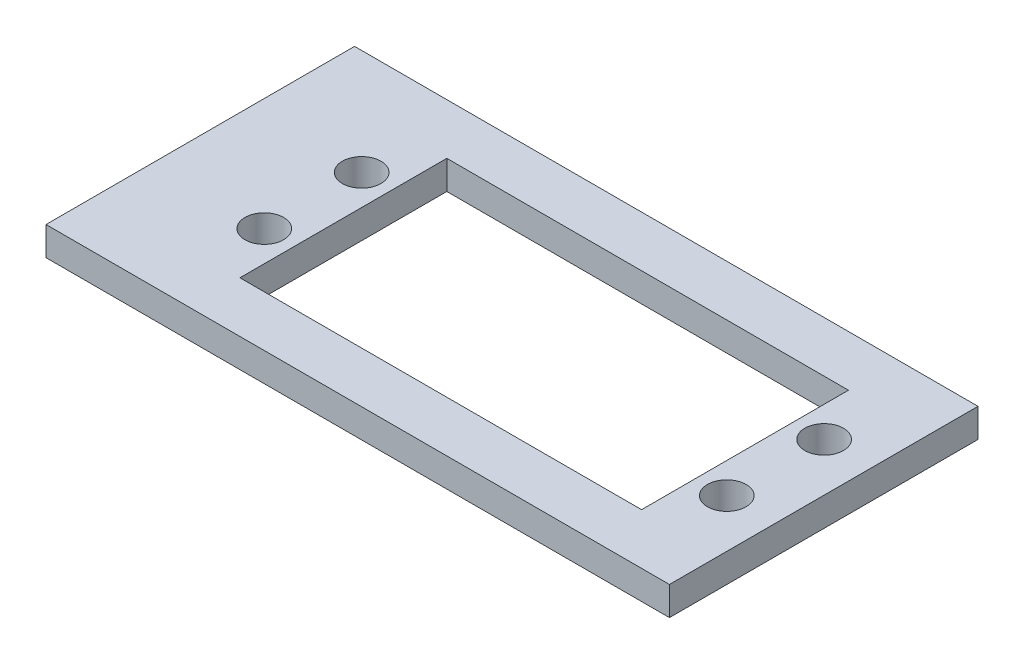
ISO-10303-21;
HEADER;
FILE_DESCRIPTION(('STEP AP214'),'2;1');
FILE_NAME('part.step','',(''),(''),'','','');
FILE_SCHEMA(('AUTOMOTIVE_DESIGN { 1 0 10303 214 1 1 1 1 }'));
ENDSEC;
DATA;
#1=APPLICATION_CONTEXT('core data for automotive mechanical design processes');
#2=APPLICATION_PROTOCOL_DEFINITION('international standard','automotive_design',2000,#1);
#3=PRODUCT_CONTEXT('',#1,'mechanical');
#4=PRODUCT('Part','Part','',(#3));
#5=PRODUCT_RELATED_PRODUCT_CATEGORY('part','',(#4));
#6=PRODUCT_DEFINITION_FORMATION('','',#4);
#7=PRODUCT_DEFINITION_CONTEXT('part definition',#1,'design');
#8=PRODUCT_DEFINITION('design','',#6,#7);
#9=PRODUCT_DEFINITION_SHAPE('','',#8);
#10=(LENGTH_UNIT() NAMED_UNIT(*) SI_UNIT(.MILLI.,.METRE.));
#11=(NAMED_UNIT(*) PLANE_ANGLE_UNIT() SI_UNIT($,.RADIAN.));
#12=(NAMED_UNIT(*) SI_UNIT($,.STERADIAN.) SOLID_ANGLE_UNIT());
#13=UNCERTAINTY_MEASURE_WITH_UNIT(LENGTH_MEASURE(1.E-05),#10,'distance_accuracy_value','');
#14=(GEOMETRIC_REPRESENTATION_CONTEXT(3) GLOBAL_UNCERTAINTY_ASSIGNED_CONTEXT((#13)) GLOBAL_UNIT_ASSIGNED_CONTEXT((#10,
#11,#12)) REPRESENTATION_CONTEXT('',''));
#15=CARTESIAN_POINT('',(0.,0.,0.));
#16=DIRECTION('',(0.,0.,1.));
#17=DIRECTION('',(1.,0.,0.));
#18=AXIS2_PLACEMENT_3D('',#15,#16,#17);
#19=CARTESIAN_POINT('',(0.,3.,-20.8673508669521));
#20=DIRECTION('',(0.,0.,-1.));
#21=DIRECTION('',(-1.,0.,0.));
#22=AXIS2_PLACEMENT_3D('',#19,#20,#21);
#23=PLANE('',#22);
#24=DIRECTION('',(1.,0.,0.));
#25=VECTOR('',#24,1.);
#26=CARTESIAN_POINT('',(0.,0.,-20.8673508669521));
#27=LINE('',#26,#25);
#28=CARTESIAN_POINT('',(-41.7204147572577,0.,-20.8673508669521));
#29=VERTEX_POINT('',#28);
#30=CARTESIAN_POINT('',(0.18958524274228,0.,-20.8673508669521));
#31=VERTEX_POINT('',#30);
#32=EDGE_CURVE('E172',#29,#31,#27,.T.);
#33=ORIENTED_EDGE('',*,*,#32,.T.);
#34=DIRECTION('',(0.,-1.,0.));
#35=VECTOR('',#34,1.);
#36=CARTESIAN_POINT('',(0.18958524274228,3.,-20.8673508669521));
#37=LINE('',#36,#35);
#38=CARTESIAN_POINT('',(0.18958524274228,3.,-20.8673508669521));
#39=VERTEX_POINT('',#38);
#40=EDGE_CURVE('E11',#39,#31,#37,.T.);
#41=ORIENTED_EDGE('',*,*,#40,.F.);
#42=DIRECTION('',(1.,0.,0.));
#43=VECTOR('',#42,1.);
#44=CARTESIAN_POINT('',(0.,3.,-20.8673508669521));
#45=LINE('',#44,#43);
#46=CARTESIAN_POINT('',(-41.7204147572577,3.,-20.8673508669521));
#47=VERTEX_POINT('',#46);
#48=EDGE_CURVE('E128',#47,#39,#45,.T.);
#49=ORIENTED_EDGE('',*,*,#48,.F.);
#50=DIRECTION('',(0.,-1.,0.));
#51=VECTOR('',#50,1.);
#52=CARTESIAN_POINT('',(-41.7204147572577,3.,-20.8673508669521));
#53=LINE('',#52,#51);
#54=EDGE_CURVE('E183',#47,#29,#53,.T.);
#55=ORIENTED_EDGE('',*,*,#54,.T.);
#56=EDGE_LOOP('',(#33,#41,#49,#55));
#57=FACE_BOUND('',#56,.T.);
#58=ADVANCED_FACE('F39',(#57),#23,.F.);
#59=CARTESIAN_POINT('',(0.18958524274228,3.,0.));
#60=DIRECTION('',(-1.,0.,0.));
#61=DIRECTION('',(0.,0.,1.));
#62=AXIS2_PLACEMENT_3D('',#59,#60,#61);
#63=PLANE('',#62);
#64=DIRECTION('',(0.,0.,-1.));
#65=VECTOR('',#64,1.);
#66=CARTESIAN_POINT('',(0.18958524274228,0.,0.));
#67=LINE('',#66,#65);
#68=CARTESIAN_POINT('',(0.18958524274228,0.,0.722649133047922));
#69=VERTEX_POINT('',#68);
#70=EDGE_CURVE('E118',#69,#31,#67,.T.);
#71=ORIENTED_EDGE('',*,*,#70,.F.);
#72=DIRECTION('',(0.,-1.,0.));
#73=VECTOR('',#72,1.);
#74=CARTESIAN_POINT('',(0.18958524274228,3.,0.722649133047922));
#75=LINE('',#74,#73);
#76=CARTESIAN_POINT('',(0.18958524274228,3.,0.722649133047922));
#77=VERTEX_POINT('',#76);
#78=EDGE_CURVE('E50',#77,#69,#75,.T.);
#79=ORIENTED_EDGE('',*,*,#78,.F.);
#80=DIRECTION('',(0.,0.,-1.));
#81=VECTOR('',#80,1.);
#82=CARTESIAN_POINT('',(0.18958524274228,3.,0.));
#83=LINE('',#82,#81);
#84=EDGE_CURVE('E116',#77,#39,#83,.T.);
#85=ORIENTED_EDGE('',*,*,#84,.T.);
#86=ORIENTED_EDGE('',*,*,#40,.T.);
#87=EDGE_LOOP('',(#71,#79,#85,#86));
#88=FACE_BOUND('',#87,.T.);
#89=ADVANCED_FACE('F115',(#88),#63,.T.);
#90=CARTESIAN_POINT('',(0.,3.,0.722649133047922));
#91=DIRECTION('',(0.,0.,-1.));
#92=DIRECTION('',(-1.,0.,0.));
#93=AXIS2_PLACEMENT_3D('',#90,#91,#92);
#94=PLANE('',#93);
#95=DIRECTION('',(1.,0.,0.));
#96=VECTOR('',#95,1.);
#97=CARTESIAN_POINT('',(0.,0.,0.722649133047922));
#98=LINE('',#97,#96);
#99=CARTESIAN_POINT('',(-41.7204147572577,0.,0.722649133047922));
#100=VERTEX_POINT('',#99);
#101=EDGE_CURVE('E178',#100,#69,#98,.T.);
#102=ORIENTED_EDGE('',*,*,#101,.F.);
#103=DIRECTION('',(0.,-1.,0.));
#104=VECTOR('',#103,1.);
#105=CARTESIAN_POINT('',(-41.7204147572577,3.,0.722649133047922));
#106=LINE('',#105,#104);
#107=CARTESIAN_POINT('',(-41.7204147572577,3.,0.722649133047922));
#108=VERTEX_POINT('',#107);
#109=EDGE_CURVE('E86',#108,#100,#106,.T.);
#110=ORIENTED_EDGE('',*,*,#109,.F.);
#111=DIRECTION('',(1.,0.,0.));
#112=VECTOR('',#111,1.);
#113=CARTESIAN_POINT('',(0.,3.,0.722649133047922));
#114=LINE('',#113,#112);
#115=EDGE_CURVE('E126',#108,#77,#114,.T.);
#116=ORIENTED_EDGE('',*,*,#115,.T.);
#117=ORIENTED_EDGE('',*,*,#78,.T.);
#118=EDGE_LOOP('',(#102,#110,#116,#117));
#119=FACE_BOUND('',#118,.T.);
#120=ADVANCED_FACE('F132',(#119),#94,.T.);
#121=CARTESIAN_POINT('',(0.,3.,-26.1714026151938));
#122=DIRECTION('',(0.,0.,1.));
#123=DIRECTION('',(1.,0.,0.));
#124=AXIS2_PLACEMENT_3D('',#121,#122,#123);
#125=PLANE('',#124);
#126=DIRECTION('',(-1.,0.,0.));
#127=VECTOR('',#126,1.);
#128=CARTESIAN_POINT('',(0.,0.,-26.1714026151938));
#129=LINE('',#128,#127);
#130=CARTESIAN_POINT('',(8.4020641389915,0.,-26.1714026151938));
#131=VERTEX_POINT('',#130);
#132=CARTESIAN_POINT('',(-56.6534698572577,0.,-26.1714026151938));
#133=VERTEX_POINT('',#132);
#134=EDGE_CURVE('E140',#131,#133,#129,.T.);
#135=ORIENTED_EDGE('',*,*,#134,.T.);
#136=DIRECTION('',(0.,-1.,0.));
#137=VECTOR('',#136,1.);
#138=CARTESIAN_POINT('',(-56.6534698572577,3.,-26.1714026151938));
#139=LINE('',#138,#137);
#140=CARTESIAN_POINT('',(-56.6534698572577,3.,-26.1714026151938));
#141=VERTEX_POINT('',#140);
#142=EDGE_CURVE('E43',#141,#133,#139,.T.);
#143=ORIENTED_EDGE('',*,*,#142,.F.);
#144=DIRECTION('',(-1.,0.,0.));
#145=VECTOR('',#144,1.);
#146=CARTESIAN_POINT('',(0.,3.,-26.1714026151938));
#147=LINE('',#146,#145);
#148=CARTESIAN_POINT('',(8.4020641389915,3.,-26.1714026151938));
#149=VERTEX_POINT('',#148);
#150=EDGE_CURVE('E98',#149,#141,#147,.T.);
#151=ORIENTED_EDGE('',*,*,#150,.F.);
#152=DIRECTION('',(0.,-1.,0.));
#153=VECTOR('',#152,1.);
#154=CARTESIAN_POINT('',(8.4020641389915,3.,-26.1714026151938));
#155=LINE('',#154,#153);
#156=EDGE_CURVE('E136',#149,#131,#155,.T.);
#157=ORIENTED_EDGE('',*,*,#156,.T.);
#158=EDGE_LOOP('',(#135,#143,#151,#157));
#159=FACE_BOUND('',#158,.T.);
#160=ADVANCED_FACE('F41',(#159),#125,.F.);
#161=CARTESIAN_POINT('',(-56.6534698572577,3.,0.));
#162=DIRECTION('',(-1.,0.,0.));
#163=DIRECTION('',(0.,0.,1.));
#164=AXIS2_PLACEMENT_3D('',#161,#162,#163);
#165=PLANE('',#164);
#166=DIRECTION('',(0.,0.,-1.));
#167=VECTOR('',#166,1.);
#168=CARTESIAN_POINT('',(-56.6534698572577,0.,0.));
#169=LINE('',#168,#167);
#170=CARTESIAN_POINT('',(-56.6534698572577,0.,6.0267008812897));
#171=VERTEX_POINT('',#170);
#172=EDGE_CURVE('E144',#171,#133,#169,.T.);
#173=ORIENTED_EDGE('',*,*,#172,.F.);
#174=DIRECTION('',(0.,-1.,0.));
#175=VECTOR('',#174,1.);
#176=CARTESIAN_POINT('',(-56.6534698572577,3.,6.0267008812897));
#177=LINE('',#176,#175);
#178=CARTESIAN_POINT('',(-56.6534698572577,3.,6.0267008812897));
#179=VERTEX_POINT('',#178);
#180=EDGE_CURVE('E192',#179,#171,#177,.T.);
#181=ORIENTED_EDGE('',*,*,#180,.F.);
#182=DIRECTION('',(0.,0.,-1.));
#183=VECTOR('',#182,1.);
#184=CARTESIAN_POINT('',(-56.6534698572577,3.,0.));
#185=LINE('',#184,#183);
#186=EDGE_CURVE('E202',#179,#141,#185,.T.);
#187=ORIENTED_EDGE('',*,*,#186,.T.);
#188=ORIENTED_EDGE('',*,*,#142,.T.);
#189=EDGE_LOOP('',(#173,#181,#187,#188));
#190=FACE_BOUND('',#189,.T.);
#191=ADVANCED_FACE('F201',(#190),#165,.T.);
#192=CARTESIAN_POINT('',(0.,3.,6.0267008812897));
#193=DIRECTION('',(0.,0.,1.));
#194=DIRECTION('',(1.,0.,0.));
#195=AXIS2_PLACEMENT_3D('',#192,#193,#194);
#196=PLANE('',#195);
#197=DIRECTION('',(-1.,0.,0.));
#198=VECTOR('',#197,1.);
#199=CARTESIAN_POINT('',(0.,0.,6.0267008812897));
#200=LINE('',#199,#198);
#201=CARTESIAN_POINT('',(8.4020641389915,0.,6.0267008812897));
#202=VERTEX_POINT('',#201);
#203=EDGE_CURVE('E148',#202,#171,#200,.T.);
#204=ORIENTED_EDGE('',*,*,#203,.F.);
#205=DIRECTION('',(0.,-1.,0.));
#206=VECTOR('',#205,1.);
#207=CARTESIAN_POINT('',(8.4020641389915,3.,6.0267008812897));
#208=LINE('',#207,#206);
#209=CARTESIAN_POINT('',(8.4020641389915,3.,6.0267008812897));
#210=VERTEX_POINT('',#209);
#211=EDGE_CURVE('E190',#210,#202,#208,.T.);
#212=ORIENTED_EDGE('',*,*,#211,.F.);
#213=DIRECTION('',(-1.,0.,0.));
#214=VECTOR('',#213,1.);
#215=CARTESIAN_POINT('',(0.,3.,6.0267008812897));
#216=LINE('',#215,#214);
#217=EDGE_CURVE('E211',#210,#179,#216,.T.);
#218=ORIENTED_EDGE('',*,*,#217,.T.);
#219=ORIENTED_EDGE('',*,*,#180,.T.);
#220=EDGE_LOOP('',(#204,#212,#218,#219));
#221=FACE_BOUND('',#220,.T.);
#222=ADVANCED_FACE('F209',(#221),#196,.T.);
#223=CARTESIAN_POINT('',(3.36458524274226,3.,-15.1523508669521));
#224=DIRECTION('',(0.,-1.,0.));
#225=DIRECTION('',(0.,0.,-1.));
#226=AXIS2_PLACEMENT_3D('',#223,#224,#225);
#227=CYLINDRICAL_SURFACE('',#226,2.01930000000001);
#228=CARTESIAN_POINT('',(3.36458524274226,3.,-15.1523508669521));
#229=DIRECTION('',(0.,1.,0.));
#230=DIRECTION('',(0.,0.,1.));
#231=AXIS2_PLACEMENT_3D('',#228,#229,#230);
#232=CIRCLE('',#231,2.01930000000001);
#233=CARTESIAN_POINT('',(3.36458524274226,3.,-13.1330508669521));
#234=VERTEX_POINT('',#233);
#235=EDGE_CURVE('E235',#234,#234,#232,.T.);
#236=ORIENTED_EDGE('',*,*,#235,.T.);
#237=EDGE_LOOP('',(#236));
#238=FACE_BOUND('',#237,.T.);
#239=CARTESIAN_POINT('',(3.36458524274226,0.,-15.1523508669521));
#240=DIRECTION('',(0.,1.,0.));
#241=DIRECTION('',(0.,0.,1.));
#242=AXIS2_PLACEMENT_3D('',#239,#240,#241);
#243=CIRCLE('',#242,2.01930000000001);
#244=CARTESIAN_POINT('',(3.36458524274226,0.,-13.1330508669521));
#245=VERTEX_POINT('',#244);
#246=EDGE_CURVE('E168',#245,#245,#243,.T.);
#247=ORIENTED_EDGE('',*,*,#246,.F.);
#248=EDGE_LOOP('',(#247));
#249=FACE_BOUND('',#248,.T.);
#250=ADVANCED_FACE('F241',(#238,#249),#227,.F.);
#251=CARTESIAN_POINT('',(3.36458524274226,3.,-4.99235086695208));
#252=DIRECTION('',(0.,-1.,0.));
#253=DIRECTION('',(0.,0.,-1.));
#254=AXIS2_PLACEMENT_3D('',#251,#252,#253);
#255=CYLINDRICAL_SURFACE('',#254,2.01930000000001);
#256=CARTESIAN_POINT('',(3.36458524274226,3.,-4.99235086695208));
#257=DIRECTION('',(0.,1.,0.));
#258=DIRECTION('',(0.,0.,1.));
#259=AXIS2_PLACEMENT_3D('',#256,#257,#258);
#260=CIRCLE('',#259,2.01930000000001);
#261=CARTESIAN_POINT('',(3.36458524274226,3.,-2.97305086695207));
#262=VERTEX_POINT('',#261);
#263=EDGE_CURVE('E231',#262,#262,#260,.T.);
#264=ORIENTED_EDGE('',*,*,#263,.T.);
#265=EDGE_LOOP('',(#264));
#266=FACE_BOUND('',#265,.T.);
#267=CARTESIAN_POINT('',(3.36458524274226,0.,-4.99235086695208));
#268=DIRECTION('',(0.,1.,0.));
#269=DIRECTION('',(0.,0.,1.));
#270=AXIS2_PLACEMENT_3D('',#267,#268,#269);
#271=CIRCLE('',#270,2.01930000000001);
#272=CARTESIAN_POINT('',(3.36458524274226,0.,-2.97305086695207));
#273=VERTEX_POINT('',#272);
#274=EDGE_CURVE('E164',#273,#273,#271,.T.);
#275=ORIENTED_EDGE('',*,*,#274,.F.);
#276=EDGE_LOOP('',(#275));
#277=FACE_BOUND('',#276,.T.);
#278=ADVANCED_FACE('F264',(#266,#277),#255,.F.);
#279=CARTESIAN_POINT('',(-44.8954147572577,3.,-15.1523508669521));
#280=DIRECTION('',(0.,-1.,0.));
#281=DIRECTION('',(0.,0.,-1.));
#282=AXIS2_PLACEMENT_3D('',#279,#280,#281);
#283=CYLINDRICAL_SURFACE('',#282,2.01930000000001);
#284=CARTESIAN_POINT('',(-44.8954147572577,3.,-15.1523508669521));
#285=DIRECTION('',(0.,1.,0.));
#286=DIRECTION('',(0.,0.,1.));
#287=AXIS2_PLACEMENT_3D('',#284,#285,#286);
#288=CIRCLE('',#287,2.01930000000001);
#289=CARTESIAN_POINT('',(-44.8954147572577,3.,-13.1330508669521));
#290=VERTEX_POINT('',#289);
#291=EDGE_CURVE('E224',#290,#290,#288,.T.);
#292=ORIENTED_EDGE('',*,*,#291,.T.);
#293=EDGE_LOOP('',(#292));
#294=FACE_BOUND('',#293,.T.);
#295=CARTESIAN_POINT('',(-44.8954147572577,0.,-15.1523508669521));
#296=DIRECTION('',(0.,1.,0.));
#297=DIRECTION('',(0.,0.,1.));
#298=AXIS2_PLACEMENT_3D('',#295,#296,#297);
#299=CIRCLE('',#298,2.01930000000001);
#300=CARTESIAN_POINT('',(-44.8954147572577,0.,-13.1330508669521));
#301=VERTEX_POINT('',#300);
#302=EDGE_CURVE('E160',#301,#301,#299,.T.);
#303=ORIENTED_EDGE('',*,*,#302,.F.);
#304=EDGE_LOOP('',(#303));
#305=FACE_BOUND('',#304,.T.);
#306=ADVANCED_FACE('F267',(#294,#305),#283,.F.);
#307=CARTESIAN_POINT('',(-44.8954147572577,3.,-4.99235086695208));
#308=DIRECTION('',(0.,-1.,0.));
#309=DIRECTION('',(0.,0.,-1.));
#310=AXIS2_PLACEMENT_3D('',#307,#308,#309);
#311=CYLINDRICAL_SURFACE('',#310,2.01930000000001);
#312=CARTESIAN_POINT('',(-44.8954147572577,3.,-4.99235086695208));
#313=DIRECTION('',(0.,1.,0.));
#314=DIRECTION('',(0.,0.,1.));
#315=AXIS2_PLACEMENT_3D('',#312,#313,#314);
#316=CIRCLE('',#315,2.01930000000001);
#317=CARTESIAN_POINT('',(-44.8954147572577,3.,-2.97305086695207));
#318=VERTEX_POINT('',#317);
#319=EDGE_CURVE('E220',#318,#318,#316,.T.);
#320=ORIENTED_EDGE('',*,*,#319,.T.);
#321=EDGE_LOOP('',(#320));
#322=FACE_BOUND('',#321,.T.);
#323=CARTESIAN_POINT('',(-44.8954147572577,0.,-4.99235086695208));
#324=DIRECTION('',(0.,1.,0.));
#325=DIRECTION('',(0.,0.,1.));
#326=AXIS2_PLACEMENT_3D('',#323,#324,#325);
#327=CIRCLE('',#326,2.01930000000001);
#328=CARTESIAN_POINT('',(-44.8954147572577,0.,-2.97305086695207));
#329=VERTEX_POINT('',#328);
#330=EDGE_CURVE('E156',#329,#329,#327,.T.);
#331=ORIENTED_EDGE('',*,*,#330,.F.);
#332=EDGE_LOOP('',(#331));
#333=FACE_BOUND('',#332,.T.);
#334=ADVANCED_FACE('F271',(#322,#333),#311,.F.);
#335=CARTESIAN_POINT('',(8.4020641389915,3.,0.));
#336=DIRECTION('',(1.,0.,0.));
#337=DIRECTION('',(0.,0.,-1.));
#338=AXIS2_PLACEMENT_3D('',#335,#336,#337);
#339=PLANE('',#338);
#340=DIRECTION('',(0.,0.,1.));
#341=VECTOR('',#340,1.);
#342=CARTESIAN_POINT('',(8.4020641389915,0.,0.));
#343=LINE('',#342,#341);
#344=EDGE_CURVE('E152',#131,#202,#343,.T.);
#345=ORIENTED_EDGE('',*,*,#344,.F.);
#346=ORIENTED_EDGE('',*,*,#156,.F.);
#347=DIRECTION('',(0.,0.,1.));
#348=VECTOR('',#347,1.);
#349=CARTESIAN_POINT('',(8.4020641389915,3.,0.));
#350=LINE('',#349,#348);
#351=EDGE_CURVE('E215',#149,#210,#350,.T.);
#352=ORIENTED_EDGE('',*,*,#351,.T.);
#353=ORIENTED_EDGE('',*,*,#211,.T.);
#354=EDGE_LOOP('',(#345,#346,#352,#353));
#355=FACE_BOUND('',#354,.T.);
#356=ADVANCED_FACE('F218',(#355),#339,.T.);
#357=CARTESIAN_POINT('',(-41.7204147572577,3.,0.));
#358=DIRECTION('',(-1.,0.,0.));
#359=DIRECTION('',(0.,0.,1.));
#360=AXIS2_PLACEMENT_3D('',#357,#358,#359);
#361=PLANE('',#360);
#362=DIRECTION('',(0.,0.,-1.));
#363=VECTOR('',#362,1.);
#364=CARTESIAN_POINT('',(-41.7204147572577,0.,0.));
#365=LINE('',#364,#363);
#366=EDGE_CURVE('E89',#100,#29,#365,.T.);
#367=ORIENTED_EDGE('',*,*,#366,.T.);
#368=ORIENTED_EDGE('',*,*,#54,.F.);
#369=DIRECTION('',(0.,0.,-1.));
#370=VECTOR('',#369,1.);
#371=CARTESIAN_POINT('',(-41.7204147572577,3.,0.));
#372=LINE('',#371,#370);
#373=EDGE_CURVE('E59',#108,#47,#372,.T.);
#374=ORIENTED_EDGE('',*,*,#373,.F.);
#375=ORIENTED_EDGE('',*,*,#109,.T.);
#376=EDGE_LOOP('',(#367,#368,#374,#375));
#377=FACE_BOUND('',#376,.T.);
#378=ADVANCED_FACE('F245',(#377),#361,.F.);
#379=CARTESIAN_POINT('',(0.,3.,0.));
#380=DIRECTION('',(0.,1.,0.));
#381=DIRECTION('',(0.,0.,1.));
#382=AXIS2_PLACEMENT_3D('',#379,#380,#381);
#383=PLANE('',#382);
#384=ORIENTED_EDGE('',*,*,#150,.T.);
#385=ORIENTED_EDGE('',*,*,#186,.F.);
#386=ORIENTED_EDGE('',*,*,#217,.F.);
#387=ORIENTED_EDGE('',*,*,#351,.F.);
#388=EDGE_LOOP('',(#384,#385,#386,#387));
#389=FACE_BOUND('',#388,.T.);
#390=ORIENTED_EDGE('',*,*,#319,.F.);
#391=EDGE_LOOP('',(#390));
#392=FACE_BOUND('',#391,.T.);
#393=ORIENTED_EDGE('',*,*,#291,.F.);
#394=EDGE_LOOP('',(#393));
#395=FACE_BOUND('',#394,.T.);
#396=ORIENTED_EDGE('',*,*,#263,.F.);
#397=EDGE_LOOP('',(#396));
#398=FACE_BOUND('',#397,.T.);
#399=ORIENTED_EDGE('',*,*,#235,.F.);
#400=EDGE_LOOP('',(#399));
#401=FACE_BOUND('',#400,.T.);
#402=ORIENTED_EDGE('',*,*,#48,.T.);
#403=ORIENTED_EDGE('',*,*,#84,.F.);
#404=ORIENTED_EDGE('',*,*,#115,.F.);
#405=ORIENTED_EDGE('',*,*,#373,.T.);
#406=EDGE_LOOP('',(#402,#403,#404,#405));
#407=FACE_BOUND('',#406,.T.);
#408=ADVANCED_FACE('F125',(#389,#392,#395,#398,#401,#407),#383,.T.);
#409=CARTESIAN_POINT('',(0.,0.,0.));
#410=DIRECTION('',(0.,1.,0.));
#411=DIRECTION('',(0.,0.,1.));
#412=AXIS2_PLACEMENT_3D('',#409,#410,#411);
#413=PLANE('',#412);
#414=ORIENTED_EDGE('',*,*,#134,.F.);
#415=ORIENTED_EDGE('',*,*,#344,.T.);
#416=ORIENTED_EDGE('',*,*,#203,.T.);
#417=ORIENTED_EDGE('',*,*,#172,.T.);
#418=EDGE_LOOP('',(#414,#415,#416,#417));
#419=FACE_BOUND('',#418,.T.);
#420=ORIENTED_EDGE('',*,*,#330,.T.);
#421=EDGE_LOOP('',(#420));
#422=FACE_BOUND('',#421,.T.);
#423=ORIENTED_EDGE('',*,*,#302,.T.);
#424=EDGE_LOOP('',(#423));
#425=FACE_BOUND('',#424,.T.);
#426=ORIENTED_EDGE('',*,*,#274,.T.);
#427=EDGE_LOOP('',(#426));
#428=FACE_BOUND('',#427,.T.);
#429=ORIENTED_EDGE('',*,*,#246,.T.);
#430=EDGE_LOOP('',(#429));
#431=FACE_BOUND('',#430,.T.);
#432=ORIENTED_EDGE('',*,*,#32,.F.);
#433=ORIENTED_EDGE('',*,*,#366,.F.);
#434=ORIENTED_EDGE('',*,*,#101,.T.);
#435=ORIENTED_EDGE('',*,*,#70,.T.);
#436=EDGE_LOOP('',(#432,#433,#434,#435));
#437=FACE_BOUND('',#436,.T.);
#438=ADVANCED_FACE('F207',(#419,#422,#425,#428,#431,#437),#413,.F.);
#439=CLOSED_SHELL('',(#58,#89,#120,#160,#191,#222,#250,#278,#306,#334,#356,#378,#408,#438));
#440=MANIFOLD_SOLID_BREP('B2',#439);
#441=ADVANCED_BREP_SHAPE_REPRESENTATION('',(#18,#440),#14);
#442=SHAPE_DEFINITION_REPRESENTATION(#9,#441);
ENDSEC;
END-ISO-10303-21;
